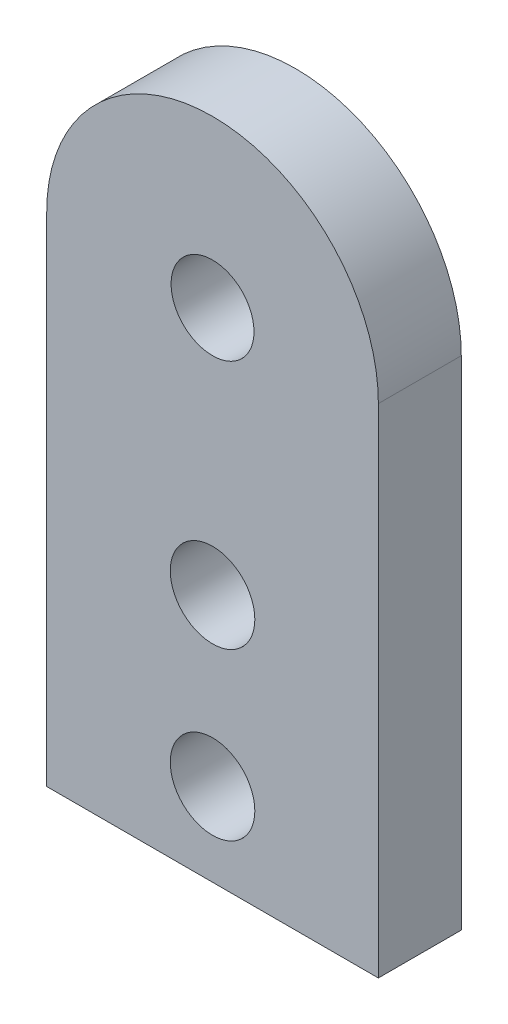
ISO-10303-21;
HEADER;
FILE_DESCRIPTION(('STEP AP214'),'2;1');
FILE_NAME('part.step','',(''),(''),'','','');
FILE_SCHEMA(('AUTOMOTIVE_DESIGN { 1 0 10303 214 1 1 1 1 }'));
ENDSEC;
DATA;
#1=APPLICATION_CONTEXT('core data for automotive mechanical design processes');
#2=APPLICATION_PROTOCOL_DEFINITION('international standard','automotive_design',2000,#1);
#3=PRODUCT_CONTEXT('',#1,'mechanical');
#4=PRODUCT('Part','Part','',(#3));
#5=PRODUCT_RELATED_PRODUCT_CATEGORY('part','',(#4));
#6=PRODUCT_DEFINITION_FORMATION('','',#4);
#7=PRODUCT_DEFINITION_CONTEXT('part definition',#1,'design');
#8=PRODUCT_DEFINITION('design','',#6,#7);
#9=PRODUCT_DEFINITION_SHAPE('','',#8);
#10=(LENGTH_UNIT() NAMED_UNIT(*) SI_UNIT(.MILLI.,.METRE.));
#11=(NAMED_UNIT(*) PLANE_ANGLE_UNIT() SI_UNIT($,.RADIAN.));
#12=(NAMED_UNIT(*) SI_UNIT($,.STERADIAN.) SOLID_ANGLE_UNIT());
#13=UNCERTAINTY_MEASURE_WITH_UNIT(LENGTH_MEASURE(1.E-05),#10,'distance_accuracy_value','');
#14=(GEOMETRIC_REPRESENTATION_CONTEXT(3) GLOBAL_UNCERTAINTY_ASSIGNED_CONTEXT((#13)) GLOBAL_UNIT_ASSIGNED_CONTEXT((#10,
#11,#12)) REPRESENTATION_CONTEXT('',''));
#15=CARTESIAN_POINT('',(0.,0.,0.));
#16=DIRECTION('',(0.,0.,1.));
#17=DIRECTION('',(1.,0.,0.));
#18=AXIS2_PLACEMENT_3D('',#15,#16,#17);
#19=CARTESIAN_POINT('',(0.,0.,5.));
#20=DIRECTION('',(0.,0.,1.));
#21=DIRECTION('',(1.,0.,0.));
#22=AXIS2_PLACEMENT_3D('',#19,#20,#21);
#23=PLANE('',#22);
#24=CARTESIAN_POINT('',(0.,0.,5.));
#25=DIRECTION('',(0.,0.,1.));
#26=DIRECTION('',(1.,0.,0.));
#27=AXIS2_PLACEMENT_3D('',#24,#25,#26);
#28=CIRCLE('',#27,2.5);
#29=CARTESIAN_POINT('',(2.5,0.,5.));
#30=VERTEX_POINT('',#29);
#31=EDGE_CURVE('E124',#30,#30,#28,.T.);
#32=ORIENTED_EDGE('',*,*,#31,.F.);
#33=EDGE_LOOP('',(#32));
#34=FACE_BOUND('',#33,.T.);
#35=CARTESIAN_POINT('',(0.,-25.,5.));
#36=DIRECTION('',(0.,0.,1.));
#37=DIRECTION('',(1.,0.,0.));
#38=AXIS2_PLACEMENT_3D('',#35,#36,#37);
#39=CIRCLE('',#38,2.55);
#40=CARTESIAN_POINT('',(2.55,-25.,5.));
#41=VERTEX_POINT('',#40);
#42=EDGE_CURVE('E100',#41,#41,#39,.T.);
#43=ORIENTED_EDGE('',*,*,#42,.F.);
#44=EDGE_LOOP('',(#43));
#45=FACE_BOUND('',#44,.T.);
#46=CARTESIAN_POINT('',(0.,0.,5.));
#47=DIRECTION('',(0.,0.,1.));
#48=DIRECTION('',(1.,0.,0.));
#49=AXIS2_PLACEMENT_3D('',#46,#47,#48);
#50=CIRCLE('',#49,10.);
#51=CARTESIAN_POINT('',(10.,0.,5.));
#52=VERTEX_POINT('',#51);
#53=CARTESIAN_POINT('',(-10.,0.,5.));
#54=VERTEX_POINT('',#53);
#55=EDGE_CURVE('E85',#52,#54,#50,.T.);
#56=ORIENTED_EDGE('',*,*,#55,.T.);
#57=DIRECTION('',(0.,-1.,0.));
#58=VECTOR('',#57,1.);
#59=CARTESIAN_POINT('',(-10.,0.,5.));
#60=LINE('',#59,#58);
#61=CARTESIAN_POINT('',(-10.,-30.,5.));
#62=VERTEX_POINT('',#61);
#63=EDGE_CURVE('E80',#54,#62,#60,.T.);
#64=ORIENTED_EDGE('',*,*,#63,.T.);
#65=DIRECTION('',(1.,0.,0.));
#66=VECTOR('',#65,1.);
#67=CARTESIAN_POINT('',(10.,-30.,5.));
#68=LINE('',#67,#66);
#69=CARTESIAN_POINT('',(10.,-30.,5.));
#70=VERTEX_POINT('',#69);
#71=EDGE_CURVE('E83',#62,#70,#68,.T.);
#72=ORIENTED_EDGE('',*,*,#71,.T.);
#73=DIRECTION('',(0.,1.,0.));
#74=VECTOR('',#73,1.);
#75=CARTESIAN_POINT('',(10.,0.,5.));
#76=LINE('',#75,#74);
#77=EDGE_CURVE('E50',#70,#52,#76,.T.);
#78=ORIENTED_EDGE('',*,*,#77,.T.);
#79=EDGE_LOOP('',(#56,#64,#72,#78));
#80=FACE_BOUND('',#79,.T.);
#81=CARTESIAN_POINT('',(0.,-15.,5.));
#82=DIRECTION('',(0.,0.,1.));
#83=DIRECTION('',(1.,0.,0.));
#84=AXIS2_PLACEMENT_3D('',#81,#82,#83);
#85=CIRCLE('',#84,2.55);
#86=CARTESIAN_POINT('',(2.55,-15.,5.));
#87=VERTEX_POINT('',#86);
#88=EDGE_CURVE('E115',#87,#87,#85,.T.);
#89=ORIENTED_EDGE('',*,*,#88,.F.);
#90=EDGE_LOOP('',(#89));
#91=FACE_BOUND('',#90,.T.);
#92=ADVANCED_FACE('F33',(#34,#45,#80,#91),#23,.T.);
#93=CARTESIAN_POINT('',(0.,0.,0.));
#94=DIRECTION('',(0.,0.,1.));
#95=DIRECTION('',(1.,0.,0.));
#96=AXIS2_PLACEMENT_3D('',#93,#94,#95);
#97=PLANE('',#96);
#98=CARTESIAN_POINT('',(0.,0.,0.));
#99=DIRECTION('',(0.,0.,1.));
#100=DIRECTION('',(1.,0.,0.));
#101=AXIS2_PLACEMENT_3D('',#98,#99,#100);
#102=CIRCLE('',#101,2.5);
#103=CARTESIAN_POINT('',(2.5,0.,0.));
#104=VERTEX_POINT('',#103);
#105=EDGE_CURVE('E121',#104,#104,#102,.T.);
#106=ORIENTED_EDGE('',*,*,#105,.T.);
#107=EDGE_LOOP('',(#106));
#108=FACE_BOUND('',#107,.T.);
#109=CARTESIAN_POINT('',(0.,-25.,0.));
#110=DIRECTION('',(0.,0.,1.));
#111=DIRECTION('',(1.,0.,0.));
#112=AXIS2_PLACEMENT_3D('',#109,#110,#111);
#113=CIRCLE('',#112,2.55);
#114=CARTESIAN_POINT('',(2.55,-25.,0.));
#115=VERTEX_POINT('',#114);
#116=EDGE_CURVE('E112',#115,#115,#113,.T.);
#117=ORIENTED_EDGE('',*,*,#116,.T.);
#118=EDGE_LOOP('',(#117));
#119=FACE_BOUND('',#118,.T.);
#120=CARTESIAN_POINT('',(0.,0.,0.));
#121=DIRECTION('',(0.,0.,1.));
#122=DIRECTION('',(1.,0.,0.));
#123=AXIS2_PLACEMENT_3D('',#120,#121,#122);
#124=CIRCLE('',#123,10.);
#125=CARTESIAN_POINT('',(10.,0.,0.));
#126=VERTEX_POINT('',#125);
#127=CARTESIAN_POINT('',(-10.,0.,0.));
#128=VERTEX_POINT('',#127);
#129=EDGE_CURVE('E97',#126,#128,#124,.T.);
#130=ORIENTED_EDGE('',*,*,#129,.F.);
#131=DIRECTION('',(0.,1.,0.));
#132=VECTOR('',#131,1.);
#133=CARTESIAN_POINT('',(10.,0.,0.));
#134=LINE('',#133,#132);
#135=CARTESIAN_POINT('',(10.,-30.,0.));
#136=VERTEX_POINT('',#135);
#137=EDGE_CURVE('E73',#136,#126,#134,.T.);
#138=ORIENTED_EDGE('',*,*,#137,.F.);
#139=DIRECTION('',(1.,0.,0.));
#140=VECTOR('',#139,1.);
#141=CARTESIAN_POINT('',(10.,-30.,0.));
#142=LINE('',#141,#140);
#143=CARTESIAN_POINT('',(-10.,-30.,0.));
#144=VERTEX_POINT('',#143);
#145=EDGE_CURVE('E67',#144,#136,#142,.T.);
#146=ORIENTED_EDGE('',*,*,#145,.F.);
#147=DIRECTION('',(0.,-1.,0.));
#148=VECTOR('',#147,1.);
#149=CARTESIAN_POINT('',(-10.,0.,0.));
#150=LINE('',#149,#148);
#151=EDGE_CURVE('E89',#128,#144,#150,.T.);
#152=ORIENTED_EDGE('',*,*,#151,.F.);
#153=EDGE_LOOP('',(#130,#138,#146,#152));
#154=FACE_BOUND('',#153,.T.);
#155=CARTESIAN_POINT('',(0.,-15.,0.));
#156=DIRECTION('',(0.,0.,1.));
#157=DIRECTION('',(1.,0.,0.));
#158=AXIS2_PLACEMENT_3D('',#155,#156,#157);
#159=CIRCLE('',#158,2.55);
#160=CARTESIAN_POINT('',(2.55,-15.,0.));
#161=VERTEX_POINT('',#160);
#162=EDGE_CURVE('E118',#161,#161,#159,.T.);
#163=ORIENTED_EDGE('',*,*,#162,.T.);
#164=EDGE_LOOP('',(#163));
#165=FACE_BOUND('',#164,.T.);
#166=ADVANCED_FACE('F108',(#108,#119,#154,#165),#97,.F.);
#167=CARTESIAN_POINT('',(0.,0.,5.));
#168=DIRECTION('',(0.,0.,-1.));
#169=DIRECTION('',(-1.,0.,0.));
#170=AXIS2_PLACEMENT_3D('',#167,#168,#169);
#171=CYLINDRICAL_SURFACE('',#170,10.);
#172=ORIENTED_EDGE('',*,*,#129,.T.);
#173=DIRECTION('',(0.,0.,-1.));
#174=VECTOR('',#173,1.);
#175=CARTESIAN_POINT('',(-10.,0.,5.));
#176=LINE('',#175,#174);
#177=EDGE_CURVE('E11',#54,#128,#176,.T.);
#178=ORIENTED_EDGE('',*,*,#177,.F.);
#179=ORIENTED_EDGE('',*,*,#55,.F.);
#180=DIRECTION('',(0.,0.,-1.));
#181=VECTOR('',#180,1.);
#182=CARTESIAN_POINT('',(10.,0.,5.));
#183=LINE('',#182,#181);
#184=EDGE_CURVE('E93',#52,#126,#183,.T.);
#185=ORIENTED_EDGE('',*,*,#184,.T.);
#186=EDGE_LOOP('',(#172,#178,#179,#185));
#187=FACE_BOUND('',#186,.T.);
#188=ADVANCED_FACE('F35',(#187),#171,.T.);
#189=CARTESIAN_POINT('',(-10.,0.,5.));
#190=DIRECTION('',(1.,0.,0.));
#191=DIRECTION('',(0.,1.,0.));
#192=AXIS2_PLACEMENT_3D('',#189,#190,#191);
#193=PLANE('',#192);
#194=ORIENTED_EDGE('',*,*,#151,.T.);
#195=DIRECTION('',(0.,0.,-1.));
#196=VECTOR('',#195,1.);
#197=CARTESIAN_POINT('',(-10.,-30.,5.));
#198=LINE('',#197,#196);
#199=EDGE_CURVE('E42',#62,#144,#198,.T.);
#200=ORIENTED_EDGE('',*,*,#199,.F.);
#201=ORIENTED_EDGE('',*,*,#63,.F.);
#202=ORIENTED_EDGE('',*,*,#177,.T.);
#203=EDGE_LOOP('',(#194,#200,#201,#202));
#204=FACE_BOUND('',#203,.T.);
#205=ADVANCED_FACE('F88',(#204),#193,.F.);
#206=CARTESIAN_POINT('',(10.,-30.,5.));
#207=DIRECTION('',(0.,1.,0.));
#208=DIRECTION('',(0.,0.,1.));
#209=AXIS2_PLACEMENT_3D('',#206,#207,#208);
#210=PLANE('',#209);
#211=ORIENTED_EDGE('',*,*,#145,.T.);
#212=DIRECTION('',(0.,0.,-1.));
#213=VECTOR('',#212,1.);
#214=CARTESIAN_POINT('',(10.,-30.,5.));
#215=LINE('',#214,#213);
#216=EDGE_CURVE('E90',#70,#136,#215,.T.);
#217=ORIENTED_EDGE('',*,*,#216,.F.);
#218=ORIENTED_EDGE('',*,*,#71,.F.);
#219=ORIENTED_EDGE('',*,*,#199,.T.);
#220=EDGE_LOOP('',(#211,#217,#218,#219));
#221=FACE_BOUND('',#220,.T.);
#222=ADVANCED_FACE('F91',(#221),#210,.F.);
#223=CARTESIAN_POINT('',(10.,0.,5.));
#224=DIRECTION('',(-1.,0.,0.));
#225=DIRECTION('',(0.,-1.,0.));
#226=AXIS2_PLACEMENT_3D('',#223,#224,#225);
#227=PLANE('',#226);
#228=ORIENTED_EDGE('',*,*,#137,.T.);
#229=ORIENTED_EDGE('',*,*,#184,.F.);
#230=ORIENTED_EDGE('',*,*,#77,.F.);
#231=ORIENTED_EDGE('',*,*,#216,.T.);
#232=EDGE_LOOP('',(#228,#229,#230,#231));
#233=FACE_BOUND('',#232,.T.);
#234=ADVANCED_FACE('F105',(#233),#227,.F.);
#235=CARTESIAN_POINT('',(0.,-25.,5.));
#236=DIRECTION('',(0.,0.,-1.));
#237=DIRECTION('',(-1.,0.,0.));
#238=AXIS2_PLACEMENT_3D('',#235,#236,#237);
#239=CYLINDRICAL_SURFACE('',#238,2.55);
#240=ORIENTED_EDGE('',*,*,#42,.T.);
#241=EDGE_LOOP('',(#240));
#242=FACE_BOUND('',#241,.T.);
#243=ORIENTED_EDGE('',*,*,#116,.F.);
#244=EDGE_LOOP('',(#243));
#245=FACE_BOUND('',#244,.T.);
#246=ADVANCED_FACE('F144',(#242,#245),#239,.F.);
#247=CARTESIAN_POINT('',(0.,-15.,5.));
#248=DIRECTION('',(0.,0.,-1.));
#249=DIRECTION('',(-1.,0.,0.));
#250=AXIS2_PLACEMENT_3D('',#247,#248,#249);
#251=CYLINDRICAL_SURFACE('',#250,2.55);
#252=ORIENTED_EDGE('',*,*,#88,.T.);
#253=EDGE_LOOP('',(#252));
#254=FACE_BOUND('',#253,.T.);
#255=ORIENTED_EDGE('',*,*,#162,.F.);
#256=EDGE_LOOP('',(#255));
#257=FACE_BOUND('',#256,.T.);
#258=ADVANCED_FACE('F135',(#254,#257),#251,.F.);
#259=CARTESIAN_POINT('',(0.,0.,0.));
#260=DIRECTION('',(0.,0.,1.));
#261=DIRECTION('',(1.,0.,0.));
#262=AXIS2_PLACEMENT_3D('',#259,#260,#261);
#263=CYLINDRICAL_SURFACE('',#262,2.5);
#264=ORIENTED_EDGE('',*,*,#105,.F.);
#265=EDGE_LOOP('',(#264));
#266=FACE_BOUND('',#265,.T.);
#267=ORIENTED_EDGE('',*,*,#31,.T.);
#268=EDGE_LOOP('',(#267));
#269=FACE_BOUND('',#268,.T.);
#270=ADVANCED_FACE('F132',(#266,#269),#263,.F.);
#271=CLOSED_SHELL('',(#92,#166,#188,#205,#222,#234,#246,#258,#270));
#272=MANIFOLD_SOLID_BREP('B2',#271);
#273=ADVANCED_BREP_SHAPE_REPRESENTATION('',(#18,#272),#14);
#274=SHAPE_DEFINITION_REPRESENTATION(#9,#273);
ENDSEC;
END-ISO-10303-21;
